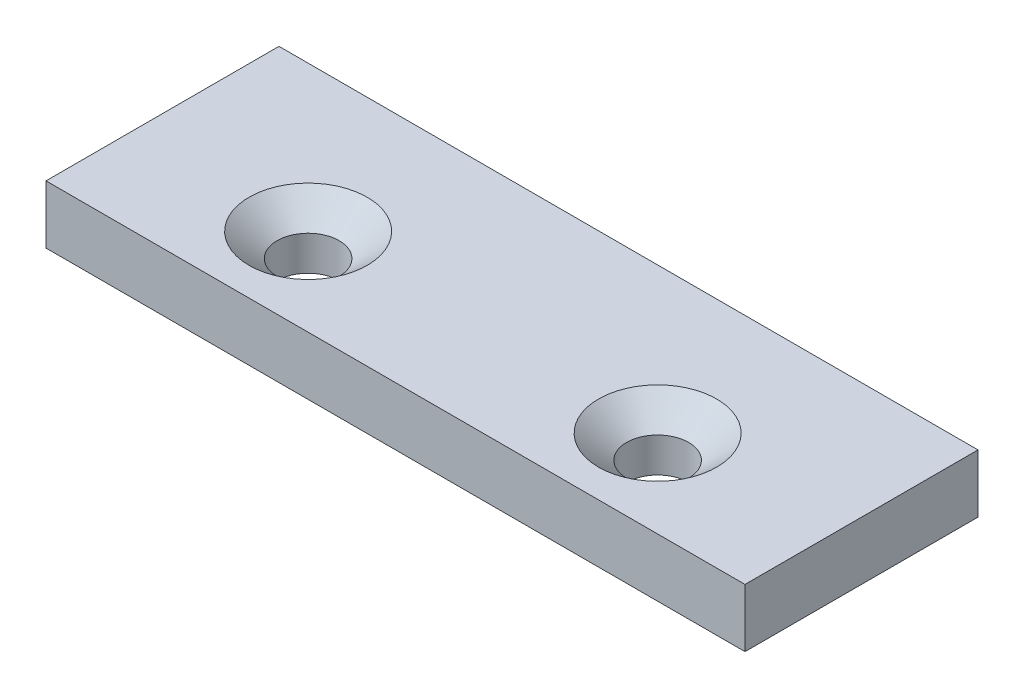
ISO-10303-21;
HEADER;
FILE_DESCRIPTION(('STEP AP214'),'2;1');
FILE_NAME('part.step','',(''),(''),'','','');
FILE_SCHEMA(('AUTOMOTIVE_DESIGN { 1 0 10303 214 1 1 1 1 }'));
ENDSEC;
DATA;
#1=APPLICATION_CONTEXT('core data for automotive mechanical design processes');
#2=APPLICATION_PROTOCOL_DEFINITION('international standard','automotive_design',2000,#1);
#3=PRODUCT_CONTEXT('',#1,'mechanical');
#4=PRODUCT('Part','Part','',(#3));
#5=PRODUCT_RELATED_PRODUCT_CATEGORY('part','',(#4));
#6=PRODUCT_DEFINITION_FORMATION('','',#4);
#7=PRODUCT_DEFINITION_CONTEXT('part definition',#1,'design');
#8=PRODUCT_DEFINITION('design','',#6,#7);
#9=PRODUCT_DEFINITION_SHAPE('','',#8);
#10=(LENGTH_UNIT() NAMED_UNIT(*) SI_UNIT(.MILLI.,.METRE.));
#11=(NAMED_UNIT(*) PLANE_ANGLE_UNIT() SI_UNIT($,.RADIAN.));
#12=(NAMED_UNIT(*) SI_UNIT($,.STERADIAN.) SOLID_ANGLE_UNIT());
#13=UNCERTAINTY_MEASURE_WITH_UNIT(LENGTH_MEASURE(1.E-05),#10,'distance_accuracy_value','');
#14=(GEOMETRIC_REPRESENTATION_CONTEXT(3) GLOBAL_UNCERTAINTY_ASSIGNED_CONTEXT((#13)) GLOBAL_UNIT_ASSIGNED_CONTEXT((#10,
#11,#12)) REPRESENTATION_CONTEXT('',''));
#15=CARTESIAN_POINT('',(0.,0.,0.));
#16=DIRECTION('',(0.,0.,1.));
#17=DIRECTION('',(1.,0.,0.));
#18=AXIS2_PLACEMENT_3D('',#15,#16,#17);
#19=CARTESIAN_POINT('',(0.,-6.35,0.));
#20=DIRECTION('',(-1.,0.,0.));
#21=DIRECTION('',(0.,0.,1.));
#22=AXIS2_PLACEMENT_3D('',#19,#20,#21);
#23=PLANE('',#22);
#24=DIRECTION('',(0.,0.,1.));
#25=VECTOR('',#24,1.);
#26=CARTESIAN_POINT('',(0.,0.,0.));
#27=LINE('',#26,#25);
#28=CARTESIAN_POINT('',(0.,0.,-25.4));
#29=VERTEX_POINT('',#28);
#30=CARTESIAN_POINT('',(0.,0.,0.));
#31=VERTEX_POINT('',#30);
#32=EDGE_CURVE('E99',#29,#31,#27,.T.);
#33=ORIENTED_EDGE('',*,*,#32,.F.);
#34=DIRECTION('',(0.,1.,0.));
#35=VECTOR('',#34,1.);
#36=CARTESIAN_POINT('',(0.,-6.35,-25.4));
#37=LINE('',#36,#35);
#38=CARTESIAN_POINT('',(0.,-6.35,-25.4));
#39=VERTEX_POINT('',#38);
#40=EDGE_CURVE('E11',#39,#29,#37,.T.);
#41=ORIENTED_EDGE('',*,*,#40,.F.);
#42=DIRECTION('',(0.,0.,1.));
#43=VECTOR('',#42,1.);
#44=CARTESIAN_POINT('',(0.,-6.35,0.));
#45=LINE('',#44,#43);
#46=CARTESIAN_POINT('',(0.,-6.35,0.));
#47=VERTEX_POINT('',#46);
#48=EDGE_CURVE('E92',#39,#47,#45,.T.);
#49=ORIENTED_EDGE('',*,*,#48,.T.);
#50=DIRECTION('',(0.,1.,0.));
#51=VECTOR('',#50,1.);
#52=CARTESIAN_POINT('',(0.,-6.35,0.));
#53=LINE('',#52,#51);
#54=EDGE_CURVE('E37',#47,#31,#53,.T.);
#55=ORIENTED_EDGE('',*,*,#54,.T.);
#56=EDGE_LOOP('',(#33,#41,#49,#55));
#57=FACE_BOUND('',#56,.T.);
#58=ADVANCED_FACE('F34',(#57),#23,.T.);
#59=CARTESIAN_POINT('',(0.,-6.35,-25.4));
#60=DIRECTION('',(0.,0.,-1.));
#61=DIRECTION('',(-1.,0.,0.));
#62=AXIS2_PLACEMENT_3D('',#59,#60,#61);
#63=PLANE('',#62);
#64=DIRECTION('',(-1.,0.,0.));
#65=VECTOR('',#64,1.);
#66=CARTESIAN_POINT('',(0.,0.,-25.4));
#67=LINE('',#66,#65);
#68=CARTESIAN_POINT('',(76.2,0.,-25.4));
#69=VERTEX_POINT('',#68);
#70=EDGE_CURVE('E94',#69,#29,#67,.T.);
#71=ORIENTED_EDGE('',*,*,#70,.F.);
#72=DIRECTION('',(0.,1.,0.));
#73=VECTOR('',#72,1.);
#74=CARTESIAN_POINT('',(76.2,-6.35,-25.4));
#75=LINE('',#74,#73);
#76=CARTESIAN_POINT('',(76.2,-6.35,-25.4));
#77=VERTEX_POINT('',#76);
#78=EDGE_CURVE('E43',#77,#69,#75,.T.);
#79=ORIENTED_EDGE('',*,*,#78,.F.);
#80=DIRECTION('',(-1.,0.,0.));
#81=VECTOR('',#80,1.);
#82=CARTESIAN_POINT('',(0.,-6.35,-25.4));
#83=LINE('',#82,#81);
#84=EDGE_CURVE('E89',#77,#39,#83,.T.);
#85=ORIENTED_EDGE('',*,*,#84,.T.);
#86=ORIENTED_EDGE('',*,*,#40,.T.);
#87=EDGE_LOOP('',(#71,#79,#85,#86));
#88=FACE_BOUND('',#87,.T.);
#89=ADVANCED_FACE('F110',(#88),#63,.T.);
#90=CARTESIAN_POINT('',(76.2,-6.35,0.));
#91=DIRECTION('',(1.,0.,0.));
#92=DIRECTION('',(0.,0.,-1.));
#93=AXIS2_PLACEMENT_3D('',#90,#91,#92);
#94=PLANE('',#93);
#95=DIRECTION('',(0.,0.,-1.));
#96=VECTOR('',#95,1.);
#97=CARTESIAN_POINT('',(76.2,0.,0.));
#98=LINE('',#97,#96);
#99=CARTESIAN_POINT('',(76.2,0.,0.));
#100=VERTEX_POINT('',#99);
#101=EDGE_CURVE('E84',#100,#69,#98,.T.);
#102=ORIENTED_EDGE('',*,*,#101,.F.);
#103=DIRECTION('',(0.,1.,0.));
#104=VECTOR('',#103,1.);
#105=CARTESIAN_POINT('',(76.2,-6.35,0.));
#106=LINE('',#105,#104);
#107=CARTESIAN_POINT('',(76.2,-6.35,0.));
#108=VERTEX_POINT('',#107);
#109=EDGE_CURVE('E79',#108,#100,#106,.T.);
#110=ORIENTED_EDGE('',*,*,#109,.F.);
#111=DIRECTION('',(0.,0.,-1.));
#112=VECTOR('',#111,1.);
#113=CARTESIAN_POINT('',(76.2,-6.35,0.));
#114=LINE('',#113,#112);
#115=EDGE_CURVE('E82',#108,#77,#114,.T.);
#116=ORIENTED_EDGE('',*,*,#115,.T.);
#117=ORIENTED_EDGE('',*,*,#78,.T.);
#118=EDGE_LOOP('',(#102,#110,#116,#117));
#119=FACE_BOUND('',#118,.T.);
#120=ADVANCED_FACE('F81',(#119),#94,.T.);
#121=CARTESIAN_POINT('',(0.,-6.35,0.));
#122=DIRECTION('',(0.,0.,1.));
#123=DIRECTION('',(1.,0.,0.));
#124=AXIS2_PLACEMENT_3D('',#121,#122,#123);
#125=PLANE('',#124);
#126=DIRECTION('',(1.,0.,0.));
#127=VECTOR('',#126,1.);
#128=CARTESIAN_POINT('',(0.,0.,0.));
#129=LINE('',#128,#127);
#130=EDGE_CURVE('E102',#31,#100,#129,.T.);
#131=ORIENTED_EDGE('',*,*,#130,.F.);
#132=ORIENTED_EDGE('',*,*,#54,.F.);
#133=DIRECTION('',(1.,0.,0.));
#134=VECTOR('',#133,1.);
#135=CARTESIAN_POINT('',(0.,-6.35,0.));
#136=LINE('',#135,#134);
#137=EDGE_CURVE('E88',#47,#108,#136,.T.);
#138=ORIENTED_EDGE('',*,*,#137,.T.);
#139=ORIENTED_EDGE('',*,*,#109,.T.);
#140=EDGE_LOOP('',(#131,#132,#138,#139));
#141=FACE_BOUND('',#140,.T.);
#142=ADVANCED_FACE('F91',(#141),#125,.T.);
#143=CARTESIAN_POINT('',(0.,-6.35,0.));
#144=DIRECTION('',(0.,-1.,0.));
#145=DIRECTION('',(0.,0.,-1.));
#146=AXIS2_PLACEMENT_3D('',#143,#144,#145);
#147=PLANE('',#146);
#148=CARTESIAN_POINT('',(19.05,-6.35,-9.525));
#149=DIRECTION('',(0.,1.,0.));
#150=DIRECTION('',(0.,0.,1.));
#151=AXIS2_PLACEMENT_3D('',#148,#149,#150);
#152=CIRCLE('',#151,3.3782);
#153=CARTESIAN_POINT('',(19.05,-6.35,-6.1468));
#154=VERTEX_POINT('',#153);
#155=EDGE_CURVE('E157',#154,#154,#152,.T.);
#156=ORIENTED_EDGE('',*,*,#155,.T.);
#157=EDGE_LOOP('',(#156));
#158=FACE_BOUND('',#157,.T.);
#159=CARTESIAN_POINT('',(57.15,-6.35,-9.525));
#160=DIRECTION('',(0.,1.,0.));
#161=DIRECTION('',(0.,0.,1.));
#162=AXIS2_PLACEMENT_3D('',#159,#160,#161);
#163=CIRCLE('',#162,3.3782);
#164=CARTESIAN_POINT('',(57.15,-6.35,-6.1468));
#165=VERTEX_POINT('',#164);
#166=EDGE_CURVE('E103',#165,#165,#163,.T.);
#167=ORIENTED_EDGE('',*,*,#166,.T.);
#168=EDGE_LOOP('',(#167));
#169=FACE_BOUND('',#168,.T.);
#170=ORIENTED_EDGE('',*,*,#48,.F.);
#171=ORIENTED_EDGE('',*,*,#84,.F.);
#172=ORIENTED_EDGE('',*,*,#115,.F.);
#173=ORIENTED_EDGE('',*,*,#137,.F.);
#174=EDGE_LOOP('',(#170,#171,#172,#173));
#175=FACE_BOUND('',#174,.T.);
#176=ADVANCED_FACE('F87',(#158,#169,#175),#147,.T.);
#177=CARTESIAN_POINT('',(0.,0.,0.));
#178=DIRECTION('',(0.,-1.,0.));
#179=DIRECTION('',(0.,0.,-1.));
#180=AXIS2_PLACEMENT_3D('',#177,#178,#179);
#181=PLANE('',#180);
#182=CARTESIAN_POINT('',(19.05,0.,-9.525));
#183=DIRECTION('',(0.,1.,0.));
#184=DIRECTION('',(0.,0.,1.));
#185=AXIS2_PLACEMENT_3D('',#182,#183,#184);
#186=CIRCLE('',#185,6.4389);
#187=CARTESIAN_POINT('',(19.05,0.,-3.0861));
#188=VERTEX_POINT('',#187);
#189=EDGE_CURVE('E155',#188,#188,#186,.T.);
#190=ORIENTED_EDGE('',*,*,#189,.F.);
#191=EDGE_LOOP('',(#190));
#192=FACE_BOUND('',#191,.T.);
#193=CARTESIAN_POINT('',(57.15,0.,-9.525));
#194=DIRECTION('',(0.,1.,0.));
#195=DIRECTION('',(0.,0.,1.));
#196=AXIS2_PLACEMENT_3D('',#193,#194,#195);
#197=CIRCLE('',#196,6.4389);
#198=CARTESIAN_POINT('',(57.15,0.,-3.0861));
#199=VERTEX_POINT('',#198);
#200=EDGE_CURVE('E161',#199,#199,#197,.T.);
#201=ORIENTED_EDGE('',*,*,#200,.F.);
#202=EDGE_LOOP('',(#201));
#203=FACE_BOUND('',#202,.T.);
#204=ORIENTED_EDGE('',*,*,#32,.T.);
#205=ORIENTED_EDGE('',*,*,#130,.T.);
#206=ORIENTED_EDGE('',*,*,#101,.T.);
#207=ORIENTED_EDGE('',*,*,#70,.T.);
#208=EDGE_LOOP('',(#204,#205,#206,#207));
#209=FACE_BOUND('',#208,.T.);
#210=ADVANCED_FACE('F109',(#192,#203,#209),#181,.F.);
#211=CARTESIAN_POINT('',(57.15,0.,-9.525));
#212=DIRECTION('',(0.,1.,0.));
#213=DIRECTION('',(0.,0.,1.));
#214=AXIS2_PLACEMENT_3D('',#211,#212,#213);
#215=CYLINDRICAL_SURFACE('',#214,3.3782);
#216=ORIENTED_EDGE('',*,*,#166,.F.);
#217=EDGE_LOOP('',(#216));
#218=FACE_BOUND('',#217,.T.);
#219=CARTESIAN_POINT('',(57.15,-2.5682322411443,-9.525));
#220=DIRECTION('',(0.,1.,0.));
#221=DIRECTION('',(0.,0.,1.));
#222=AXIS2_PLACEMENT_3D('',#219,#220,#221);
#223=CIRCLE('',#222,3.3782);
#224=CARTESIAN_POINT('',(57.15,-2.5682322411443,-6.1468));
#225=VERTEX_POINT('',#224);
#226=EDGE_CURVE('E164',#225,#225,#223,.T.);
#227=ORIENTED_EDGE('',*,*,#226,.T.);
#228=EDGE_LOOP('',(#227));
#229=FACE_BOUND('',#228,.T.);
#230=ADVANCED_FACE('F128',(#218,#229),#215,.F.);
#231=CARTESIAN_POINT('',(57.15,0.,-9.525));
#232=DIRECTION('',(0.,1.,0.));
#233=DIRECTION('',(0.,0.,1.));
#234=AXIS2_PLACEMENT_3D('',#231,#232,#233);
#235=CONICAL_SURFACE('',#234,6.4389,0.872664625997165);
#236=ORIENTED_EDGE('',*,*,#226,.F.);
#237=EDGE_LOOP('',(#236));
#238=FACE_BOUND('',#237,.T.);
#239=ORIENTED_EDGE('',*,*,#200,.T.);
#240=EDGE_LOOP('',(#239));
#241=FACE_BOUND('',#240,.T.);
#242=ADVANCED_FACE('F135',(#238,#241),#235,.F.);
#243=CARTESIAN_POINT('',(19.05,0.,-9.525));
#244=DIRECTION('',(0.,1.,0.));
#245=DIRECTION('',(0.,0.,1.));
#246=AXIS2_PLACEMENT_3D('',#243,#244,#245);
#247=CYLINDRICAL_SURFACE('',#246,3.3782);
#248=ORIENTED_EDGE('',*,*,#155,.F.);
#249=EDGE_LOOP('',(#248));
#250=FACE_BOUND('',#249,.T.);
#251=CARTESIAN_POINT('',(19.05,-2.5682322411443,-9.525));
#252=DIRECTION('',(0.,1.,0.));
#253=DIRECTION('',(0.,0.,1.));
#254=AXIS2_PLACEMENT_3D('',#251,#252,#253);
#255=CIRCLE('',#254,3.3782);
#256=CARTESIAN_POINT('',(19.05,-2.5682322411443,-6.1468));
#257=VERTEX_POINT('',#256);
#258=EDGE_CURVE('E152',#257,#257,#255,.T.);
#259=ORIENTED_EDGE('',*,*,#258,.T.);
#260=EDGE_LOOP('',(#259));
#261=FACE_BOUND('',#260,.T.);
#262=ADVANCED_FACE('F139',(#250,#261),#247,.F.);
#263=CARTESIAN_POINT('',(19.05,0.,-9.525));
#264=DIRECTION('',(0.,1.,0.));
#265=DIRECTION('',(0.,0.,1.));
#266=AXIS2_PLACEMENT_3D('',#263,#264,#265);
#267=CONICAL_SURFACE('',#266,6.4389,0.872664625997166);
#268=ORIENTED_EDGE('',*,*,#258,.F.);
#269=EDGE_LOOP('',(#268));
#270=FACE_BOUND('',#269,.T.);
#271=ORIENTED_EDGE('',*,*,#189,.T.);
#272=EDGE_LOOP('',(#271));
#273=FACE_BOUND('',#272,.T.);
#274=ADVANCED_FACE('F143',(#270,#273),#267,.F.);
#275=CLOSED_SHELL('',(#58,#89,#120,#142,#176,#210,#230,#242,#262,#274));
#276=MANIFOLD_SOLID_BREP('B2',#275);
#277=ADVANCED_BREP_SHAPE_REPRESENTATION('',(#18,#276),#14);
#278=SHAPE_DEFINITION_REPRESENTATION(#9,#277);
ENDSEC;
END-ISO-10303-21;
